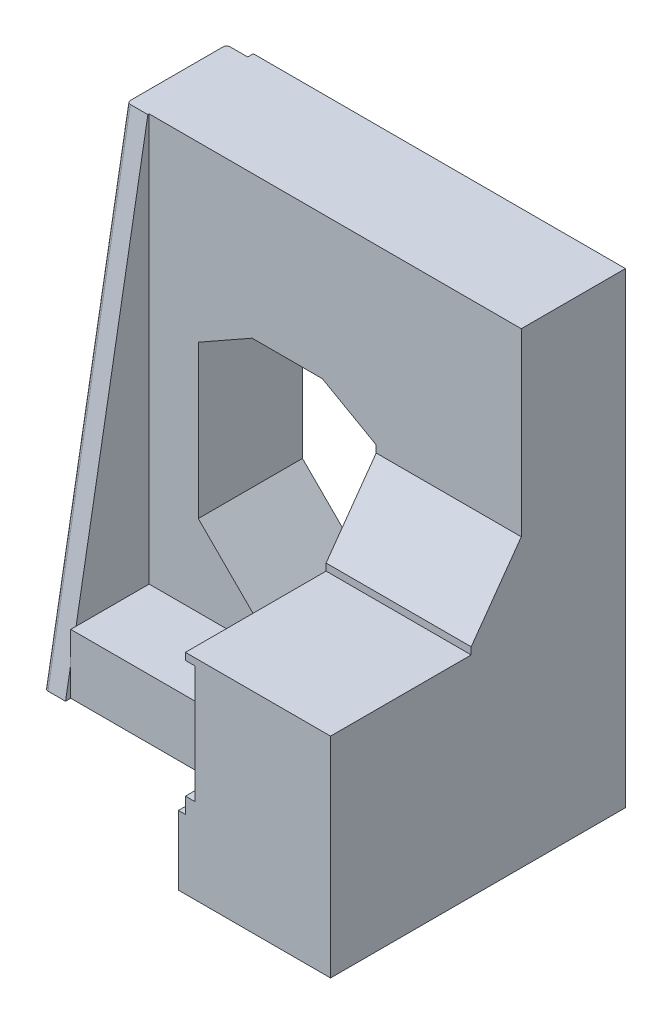
ISO-10303-21;
HEADER;
FILE_DESCRIPTION(('STEP AP214'),'2;1');
FILE_NAME('part.step','',(''),(''),'','','');
FILE_SCHEMA(('AUTOMOTIVE_DESIGN { 1 0 10303 214 1 1 1 1 }'));
ENDSEC;
DATA;
#1=APPLICATION_CONTEXT('core data for automotive mechanical design processes');
#2=APPLICATION_PROTOCOL_DEFINITION('international standard','automotive_design',2000,#1);
#3=PRODUCT_CONTEXT('',#1,'mechanical');
#4=PRODUCT('Part','Part','',(#3));
#5=PRODUCT_RELATED_PRODUCT_CATEGORY('part','',(#4));
#6=PRODUCT_DEFINITION_FORMATION('','',#4);
#7=PRODUCT_DEFINITION_CONTEXT('part definition',#1,'design');
#8=PRODUCT_DEFINITION('design','',#6,#7);
#9=PRODUCT_DEFINITION_SHAPE('','',#8);
#10=(LENGTH_UNIT() NAMED_UNIT(*) SI_UNIT(.MILLI.,.METRE.));
#11=(NAMED_UNIT(*) PLANE_ANGLE_UNIT() SI_UNIT($,.RADIAN.));
#12=(NAMED_UNIT(*) SI_UNIT($,.STERADIAN.) SOLID_ANGLE_UNIT());
#13=UNCERTAINTY_MEASURE_WITH_UNIT(LENGTH_MEASURE(1.E-05),#10,'distance_accuracy_value','');
#14=(GEOMETRIC_REPRESENTATION_CONTEXT(3) GLOBAL_UNCERTAINTY_ASSIGNED_CONTEXT((#13)) GLOBAL_UNIT_ASSIGNED_CONTEXT((#10,
#11,#12)) REPRESENTATION_CONTEXT('',''));
#15=CARTESIAN_POINT('',(0.,0.,0.));
#16=DIRECTION('',(0.,0.,1.));
#17=DIRECTION('',(1.,0.,0.));
#18=AXIS2_PLACEMENT_3D('',#15,#16,#17);
#19=CARTESIAN_POINT('',(-90.,260.,990.));
#20=DIRECTION('',(0.,1.,0.));
#21=DIRECTION('',(-1.,0.,0.));
#22=AXIS2_PLACEMENT_3D('',#19,#20,#21);
#23=PLANE('',#22);
#24=DIRECTION('',(-1.,0.,0.));
#25=VECTOR('',#24,1.);
#26=CARTESIAN_POINT('',(1000.,260.,-690.));
#27=LINE('',#26,#25);
#28=CARTESIAN_POINT('',(74.,260.,-690.));
#29=VERTEX_POINT('',#28);
#30=CARTESIAN_POINT('',(-75.,260.,-690.));
#31=VERTEX_POINT('',#30);
#32=EDGE_CURVE('E39',#29,#31,#27,.T.);
#33=ORIENTED_EDGE('',*,*,#32,.T.);
#34=DIRECTION('',(0.,0.,1.));
#35=VECTOR('',#34,1.);
#36=CARTESIAN_POINT('',(-75.,260.,-690.));
#37=LINE('',#36,#35);
#38=CARTESIAN_POINT('',(-75.,260.,-245.));
#39=VERTEX_POINT('',#38);
#40=EDGE_CURVE('E242',#31,#39,#37,.T.);
#41=ORIENTED_EDGE('',*,*,#40,.T.);
#42=DIRECTION('',(-1.,0.,0.));
#43=VECTOR('',#42,1.);
#44=CARTESIAN_POINT('',(-90.,260.,-245.));
#45=LINE('',#44,#43);
#46=CARTESIAN_POINT('',(-590.,260.,-245.));
#47=VERTEX_POINT('',#46);
#48=EDGE_CURVE('E32',#39,#47,#45,.T.);
#49=ORIENTED_EDGE('',*,*,#48,.T.);
#50=DIRECTION('',(0.,0.,1.));
#51=VECTOR('',#50,1.);
#52=CARTESIAN_POINT('',(-590.,260.,-314.227673486614));
#53=LINE('',#52,#51);
#54=CARTESIAN_POINT('',(-590.,260.,67.2881234247409));
#55=VERTEX_POINT('',#54);
#56=EDGE_CURVE('E460',#47,#55,#53,.T.);
#57=ORIENTED_EDGE('',*,*,#56,.T.);
#58=DIRECTION('',(0.,0.,1.));
#59=VECTOR('',#58,1.);
#60=CARTESIAN_POINT('',(-590.,260.,-830.));
#61=LINE('',#60,#59);
#62=CARTESIAN_POINT('',(-590.,260.,90.));
#63=VERTEX_POINT('',#62);
#64=EDGE_CURVE('E280',#55,#63,#61,.T.);
#65=ORIENTED_EDGE('',*,*,#64,.T.);
#66=DIRECTION('',(1.,0.,0.));
#67=VECTOR('',#66,1.);
#68=CARTESIAN_POINT('',(-90.,260.,90.));
#69=LINE('',#68,#67);
#70=CARTESIAN_POINT('',(74.,260.,90.));
#71=VERTEX_POINT('',#70);
#72=EDGE_CURVE('E264',#63,#71,#69,.T.);
#73=ORIENTED_EDGE('',*,*,#72,.T.);
#74=DIRECTION('',(0.,0.,-1.));
#75=VECTOR('',#74,1.);
#76=CARTESIAN_POINT('',(74.,260.,990.));
#77=LINE('',#76,#75);
#78=EDGE_CURVE('E342',#71,#29,#77,.T.);
#79=ORIENTED_EDGE('',*,*,#78,.T.);
#80=EDGE_LOOP('',(#33,#41,#49,#57,#65,#73,#79));
#81=FACE_BOUND('',#80,.T.);
#82=ADVANCED_FACE('F17',(#81),#23,.T.);
#83=CARTESIAN_POINT('',(-380.,1260.,990.));
#84=DIRECTION('',(1.,0.,0.));
#85=DIRECTION('',(0.,1.,0.));
#86=AXIS2_PLACEMENT_3D('',#83,#84,#85);
#87=PLANE('',#86);
#88=DIRECTION('',(0.,-1.,0.));
#89=VECTOR('',#88,1.);
#90=CARTESIAN_POINT('',(-380.,1260.,-245.));
#91=LINE('',#90,#89);
#92=CARTESIAN_POINT('',(-380.,1260.,-245.));
#93=VERTEX_POINT('',#92);
#94=CARTESIAN_POINT('',(-380.,607.5,-245.));
#95=VERTEX_POINT('',#94);
#96=EDGE_CURVE('E301',#93,#95,#91,.T.);
#97=ORIENTED_EDGE('',*,*,#96,.T.);
#98=DIRECTION('',(0.,0.,1.));
#99=VECTOR('',#98,1.);
#100=CARTESIAN_POINT('',(-380.,607.5,-690.));
#101=LINE('',#100,#99);
#102=CARTESIAN_POINT('',(-380.,607.5,-690.));
#103=VERTEX_POINT('',#102);
#104=EDGE_CURVE('E234',#103,#95,#101,.T.);
#105=ORIENTED_EDGE('',*,*,#104,.F.);
#106=DIRECTION('',(0.,1.,0.));
#107=VECTOR('',#106,1.);
#108=CARTESIAN_POINT('',(-380.,5.00000000000008,-690.));
#109=LINE('',#108,#107);
#110=CARTESIAN_POINT('',(-380.,1260.,-690.));
#111=VERTEX_POINT('',#110);
#112=EDGE_CURVE('E368',#103,#111,#109,.T.);
#113=ORIENTED_EDGE('',*,*,#112,.T.);
#114=DIRECTION('',(0.,0.,-1.));
#115=VECTOR('',#114,1.);
#116=CARTESIAN_POINT('',(-380.,1260.,990.));
#117=LINE('',#116,#115);
#118=EDGE_CURVE('E344',#93,#111,#117,.T.);
#119=ORIENTED_EDGE('',*,*,#118,.F.);
#120=EDGE_LOOP('',(#97,#105,#113,#119));
#121=FACE_BOUND('',#120,.T.);
#122=ADVANCED_FACE('F554',(#121),#87,.T.);
#123=CARTESIAN_POINT('',(-590.,4.9999999999999,-314.227673486614));
#124=DIRECTION('',(1.,0.,0.));
#125=DIRECTION('',(0.,-0.17364817766693,-0.984807753012208));
#126=AXIS2_PLACEMENT_3D('',#123,#124,#125);
#127=PLANE('',#126);
#128=ORIENTED_EDGE('',*,*,#56,.F.);
#129=DIRECTION('',(0.,1.,0.));
#130=VECTOR('',#129,1.);
#131=CARTESIAN_POINT('',(-590.,2000.,-245.));
#132=LINE('',#131,#130);
#133=CARTESIAN_POINT('',(-590.,2000.,-245.));
#134=VERTEX_POINT('',#133);
#135=EDGE_CURVE('E303',#47,#134,#132,.T.);
#136=ORIENTED_EDGE('',*,*,#135,.T.);
#137=DIRECTION('',(0.,0.,1.));
#138=VECTOR('',#137,1.);
#139=CARTESIAN_POINT('',(-590.,2000.,-666.));
#140=LINE('',#139,#138);
#141=CARTESIAN_POINT('',(-590.,2000.,-239.520823007988));
#142=VERTEX_POINT('',#141);
#143=EDGE_CURVE('E438',#134,#142,#140,.T.);
#144=ORIENTED_EDGE('',*,*,#143,.T.);
#145=DIRECTION('',(0.,-0.984807753012208,0.17364817766693));
#146=VECTOR('',#145,1.);
#147=CARTESIAN_POINT('',(-590.,2000.,-239.520823007988));
#148=LINE('',#147,#146);
#149=EDGE_CURVE('E442',#142,#55,#148,.T.);
#150=ORIENTED_EDGE('',*,*,#149,.T.);
#151=EDGE_LOOP('',(#128,#136,#144,#150));
#152=FACE_BOUND('',#151,.T.);
#153=ADVANCED_FACE('F559',(#152),#127,.T.);
#154=CARTESIAN_POINT('',(-680.,4.99999999999988,112.251503505399));
#155=DIRECTION('',(0.,-1.,0.));
#156=DIRECTION('',(0.,0.,1.));
#157=AXIS2_PLACEMENT_3D('',#154,#155,#156);
#158=PLANE('',#157);
#159=DIRECTION('',(1.,0.,0.));
#160=VECTOR('',#159,1.);
#161=CARTESIAN_POINT('',(-590.,5.,570.));
#162=LINE('',#161,#160);
#163=CARTESIAN_POINT('',(350.,4.99999999999987,570.));
#164=VERTEX_POINT('',#163);
#165=CARTESIAN_POINT('',(1000.,5.,570.));
#166=VERTEX_POINT('',#165);
#167=EDGE_CURVE('E379',#164,#166,#162,.T.);
#168=ORIENTED_EDGE('',*,*,#167,.F.);
#169=DIRECTION('',(0.,0.,-1.));
#170=VECTOR('',#169,1.);
#171=CARTESIAN_POINT('',(350.,4.99999999999984,112.251503505399));
#172=LINE('',#171,#170);
#173=CARTESIAN_POINT('',(350.,4.99999999999984,90.));
#174=VERTEX_POINT('',#173);
#175=EDGE_CURVE('E273',#164,#174,#172,.T.);
#176=ORIENTED_EDGE('',*,*,#175,.T.);
#177=DIRECTION('',(-1.,0.,0.));
#178=VECTOR('',#177,1.);
#179=CARTESIAN_POINT('',(-680.,4.99999999999988,90.));
#180=LINE('',#179,#178);
#181=CARTESIAN_POINT('',(-590.,4.99999999999989,90.));
#182=VERTEX_POINT('',#181);
#183=EDGE_CURVE('E267',#174,#182,#180,.T.);
#184=ORIENTED_EDGE('',*,*,#183,.T.);
#185=DIRECTION('',(0.,0.,1.));
#186=VECTOR('',#185,1.);
#187=CARTESIAN_POINT('',(-590.,4.99999999999988,112.251503505399));
#188=LINE('',#187,#186);
#189=CARTESIAN_POINT('',(-590.,5.,112.251503505399));
#190=VERTEX_POINT('',#189);
#191=EDGE_CURVE('E277',#182,#190,#188,.T.);
#192=ORIENTED_EDGE('',*,*,#191,.T.);
#193=DIRECTION('',(1.,0.,0.));
#194=VECTOR('',#193,1.);
#195=CARTESIAN_POINT('',(-680.,5.,112.251503505399));
#196=LINE('',#195,#194);
#197=CARTESIAN_POINT('',(-665.,5.,112.251503505399));
#198=VERTEX_POINT('',#197);
#199=EDGE_CURVE('E448',#198,#190,#196,.T.);
#200=ORIENTED_EDGE('',*,*,#199,.F.);
#201=CARTESIAN_POINT('',(-665.,4.99999999999967,97.0201043271133));
#202=DIRECTION('',(0.,-1.,0.));
#203=DIRECTION('',(0.,0.,-1.));
#204=AXIS2_PLACEMENT_3D('',#201,#202,#203);
#205=ELLIPSE('',#204,15.2313991782861,15.);
#206=CARTESIAN_POINT('',(-680.,4.99999999999988,97.0201043271132));
#207=VERTEX_POINT('',#206);
#208=EDGE_CURVE('E465',#198,#207,#205,.T.);
#209=ORIENTED_EDGE('',*,*,#208,.T.);
#210=DIRECTION('',(0.,0.,-1.));
#211=VECTOR('',#210,1.);
#212=CARTESIAN_POINT('',(-680.,4.99999999999988,112.251503505399));
#213=LINE('',#212,#211);
#214=CARTESIAN_POINT('',(-680.,4.99999999999989,-298.996274308327));
#215=VERTEX_POINT('',#214);
#216=EDGE_CURVE('E445',#207,#215,#213,.T.);
#217=ORIENTED_EDGE('',*,*,#216,.T.);
#218=CARTESIAN_POINT('',(-665.,4.99999999999987,-298.996274308327));
#219=DIRECTION('',(0.,-1.,0.));
#220=DIRECTION('',(0.,0.,1.));
#221=AXIS2_PLACEMENT_3D('',#218,#219,#220);
#222=ELLIPSE('',#221,15.2313991782861,15.);
#223=CARTESIAN_POINT('',(-665.,4.99999999999946,-314.227673486614));
#224=VERTEX_POINT('',#223);
#225=EDGE_CURVE('E479',#215,#224,#222,.T.);
#226=ORIENTED_EDGE('',*,*,#225,.T.);
#227=DIRECTION('',(1.,0.,0.));
#228=VECTOR('',#227,1.);
#229=CARTESIAN_POINT('',(-680.,4.99999999999946,-314.227673486614));
#230=LINE('',#229,#228);
#231=CARTESIAN_POINT('',(-590.,4.99999999999945,-314.227673486614));
#232=VERTEX_POINT('',#231);
#233=EDGE_CURVE('E458',#224,#232,#230,.T.);
#234=ORIENTED_EDGE('',*,*,#233,.T.);
#235=DIRECTION('',(0.,0.,1.));
#236=VECTOR('',#235,1.);
#237=CARTESIAN_POINT('',(-590.,4.99999999999987,-690.));
#238=LINE('',#237,#236);
#239=CARTESIAN_POINT('',(-590.,4.99999999999987,-690.));
#240=VERTEX_POINT('',#239);
#241=EDGE_CURVE('E393',#240,#232,#238,.T.);
#242=ORIENTED_EDGE('',*,*,#241,.F.);
#243=DIRECTION('',(1.,0.,0.));
#244=VECTOR('',#243,1.);
#245=CARTESIAN_POINT('',(-590.,5.,-690.));
#246=LINE('',#245,#244);
#247=CARTESIAN_POINT('',(1000.,5.,-690.));
#248=VERTEX_POINT('',#247);
#249=EDGE_CURVE('E383',#240,#248,#246,.T.);
#250=ORIENTED_EDGE('',*,*,#249,.T.);
#251=DIRECTION('',(0.,0.,1.));
#252=VECTOR('',#251,1.);
#253=CARTESIAN_POINT('',(1000.,5.,-690.));
#254=LINE('',#253,#252);
#255=EDGE_CURVE('E404',#248,#166,#254,.T.);
#256=ORIENTED_EDGE('',*,*,#255,.T.);
#257=EDGE_LOOP('',(#168,#176,#184,#192,#200,#209,#217,#226,#234,#242,#250,#256));
#258=FACE_BOUND('',#257,.T.);
#259=ADVANCED_FACE('F19',(#258),#158,.T.);
#260=CARTESIAN_POINT('',(1000.,5.,570.));
#261=DIRECTION('',(0.,0.,1.));
#262=DIRECTION('',(1.,0.,0.));
#263=AXIS2_PLACEMENT_3D('',#260,#261,#262);
#264=PLANE('',#263);
#265=DIRECTION('',(-1.,0.,0.));
#266=VECTOR('',#265,1.);
#267=CARTESIAN_POINT('',(1000.,300.,570.));
#268=LINE('',#267,#266);
#269=CARTESIAN_POINT('',(380.,300.,570.));
#270=VERTEX_POINT('',#269);
#271=CARTESIAN_POINT('',(350.,300.,570.));
#272=VERTEX_POINT('',#271);
#273=EDGE_CURVE('E421',#270,#272,#268,.T.);
#274=ORIENTED_EDGE('',*,*,#273,.T.);
#275=DIRECTION('',(0.,-1.,0.));
#276=VECTOR('',#275,1.);
#277=CARTESIAN_POINT('',(350.,5.,570.));
#278=LINE('',#277,#276);
#279=EDGE_CURVE('E270',#272,#164,#278,.T.);
#280=ORIENTED_EDGE('',*,*,#279,.T.);
#281=ORIENTED_EDGE('',*,*,#167,.T.);
#282=DIRECTION('',(0.,1.,0.));
#283=VECTOR('',#282,1.);
#284=CARTESIAN_POINT('',(1000.,5.,570.));
#285=LINE('',#284,#283);
#286=CARTESIAN_POINT('',(1000.,900.,570.));
#287=VERTEX_POINT('',#286);
#288=EDGE_CURVE('E380',#166,#287,#285,.T.);
#289=ORIENTED_EDGE('',*,*,#288,.T.);
#290=DIRECTION('',(-1.,0.,0.));
#291=VECTOR('',#290,1.);
#292=CARTESIAN_POINT('',(1000.,900.,570.));
#293=LINE('',#292,#291);
#294=CARTESIAN_POINT('',(380.,900.,570.));
#295=VERTEX_POINT('',#294);
#296=EDGE_CURVE('E317',#287,#295,#293,.T.);
#297=ORIENTED_EDGE('',*,*,#296,.T.);
#298=DIRECTION('',(0.,-1.,0.));
#299=VECTOR('',#298,1.);
#300=CARTESIAN_POINT('',(380.,5.,570.));
#301=LINE('',#300,#299);
#302=CARTESIAN_POINT('',(380.,870.,570.));
#303=VERTEX_POINT('',#302);
#304=EDGE_CURVE('E407',#295,#303,#301,.T.);
#305=ORIENTED_EDGE('',*,*,#304,.T.);
#306=DIRECTION('',(1.,0.,0.));
#307=VECTOR('',#306,1.);
#308=CARTESIAN_POINT('',(1000.,870.,570.));
#309=LINE('',#308,#307);
#310=CARTESIAN_POINT('',(420.,870.,570.));
#311=VERTEX_POINT('',#310);
#312=EDGE_CURVE('E409',#303,#311,#309,.T.);
#313=ORIENTED_EDGE('',*,*,#312,.T.);
#314=DIRECTION('',(0.,-1.,0.));
#315=VECTOR('',#314,1.);
#316=CARTESIAN_POINT('',(420.,5.,570.));
#317=LINE('',#316,#315);
#318=CARTESIAN_POINT('',(420.,368.,570.));
#319=VERTEX_POINT('',#318);
#320=EDGE_CURVE('E412',#311,#319,#317,.T.);
#321=ORIENTED_EDGE('',*,*,#320,.T.);
#322=DIRECTION('',(-1.,0.,0.));
#323=VECTOR('',#322,1.);
#324=CARTESIAN_POINT('',(1000.,368.,570.));
#325=LINE('',#324,#323);
#326=CARTESIAN_POINT('',(380.,368.,570.));
#327=VERTEX_POINT('',#326);
#328=EDGE_CURVE('E415',#319,#327,#325,.T.);
#329=ORIENTED_EDGE('',*,*,#328,.T.);
#330=DIRECTION('',(0.,-1.,0.));
#331=VECTOR('',#330,1.);
#332=CARTESIAN_POINT('',(380.,5.,570.));
#333=LINE('',#332,#331);
#334=EDGE_CURVE('E418',#327,#270,#333,.T.);
#335=ORIENTED_EDGE('',*,*,#334,.T.);
#336=EDGE_LOOP('',(#274,#280,#281,#289,#297,#305,#313,#321,#329,#335));
#337=FACE_BOUND('',#336,.T.);
#338=ADVANCED_FACE('F540',(#337),#264,.T.);
#339=CARTESIAN_POINT('',(74.,260.,990.));
#340=DIRECTION('',(-0.92847669088526,0.371390676354104,0.));
#341=DIRECTION('',(-0.371390676354104,-0.928476690885259,0.));
#342=AXIS2_PLACEMENT_3D('',#339,#340,#341);
#343=PLANE('',#342);
#344=ORIENTED_EDGE('',*,*,#78,.F.);
#345=DIRECTION('',(0.371390676354104,0.928476690885259,0.));
#346=VECTOR('',#345,1.);
#347=CARTESIAN_POINT('',(74.,260.,90.));
#348=LINE('',#347,#346);
#349=CARTESIAN_POINT('',(90.,300.,90.));
#350=VERTEX_POINT('',#349);
#351=EDGE_CURVE('E261',#71,#350,#348,.T.);
#352=ORIENTED_EDGE('',*,*,#351,.T.);
#353=DIRECTION('',(0.,0.,-1.));
#354=VECTOR('',#353,1.);
#355=CARTESIAN_POINT('',(90.,300.,990.));
#356=LINE('',#355,#354);
#357=CARTESIAN_POINT('',(90.,300.,-690.));
#358=VERTEX_POINT('',#357);
#359=EDGE_CURVE('E340',#350,#358,#356,.T.);
#360=ORIENTED_EDGE('',*,*,#359,.T.);
#361=DIRECTION('',(-0.371390676354104,-0.928476690885259,0.));
#362=VECTOR('',#361,1.);
#363=CARTESIAN_POINT('',(113.793103448276,359.48275862069,-690.));
#364=LINE('',#363,#362);
#365=EDGE_CURVE('E364',#358,#29,#364,.T.);
#366=ORIENTED_EDGE('',*,*,#365,.T.);
#367=EDGE_LOOP('',(#344,#352,#360,#366));
#368=FACE_BOUND('',#367,.T.);
#369=ADVANCED_FACE('F489',(#368),#343,.T.);
#370=CARTESIAN_POINT('',(90.,300.,990.));
#371=DIRECTION('',(0.,1.,0.));
#372=DIRECTION('',(-1.,0.,0.));
#373=AXIS2_PLACEMENT_3D('',#370,#371,#372);
#374=PLANE('',#373);
#375=DIRECTION('',(1.,0.,0.));
#376=VECTOR('',#375,1.);
#377=CARTESIAN_POINT('',(90.,300.,90.));
#378=LINE('',#377,#376);
#379=CARTESIAN_POINT('',(350.,300.,90.));
#380=VERTEX_POINT('',#379);
#381=EDGE_CURVE('E25',#350,#380,#378,.T.);
#382=ORIENTED_EDGE('',*,*,#381,.T.);
#383=DIRECTION('',(0.,0.,1.));
#384=VECTOR('',#383,1.);
#385=CARTESIAN_POINT('',(350.,300.,990.));
#386=LINE('',#385,#384);
#387=EDGE_CURVE('E11',#380,#272,#386,.T.);
#388=ORIENTED_EDGE('',*,*,#387,.T.);
#389=ORIENTED_EDGE('',*,*,#273,.F.);
#390=DIRECTION('',(0.,0.,-1.));
#391=VECTOR('',#390,1.);
#392=CARTESIAN_POINT('',(380.,300.,990.));
#393=LINE('',#392,#391);
#394=CARTESIAN_POINT('',(380.,300.,-690.));
#395=VERTEX_POINT('',#394);
#396=EDGE_CURVE('E337',#270,#395,#393,.T.);
#397=ORIENTED_EDGE('',*,*,#396,.T.);
#398=DIRECTION('',(-1.,0.,0.));
#399=VECTOR('',#398,1.);
#400=CARTESIAN_POINT('',(1000.,300.,-690.));
#401=LINE('',#400,#399);
#402=EDGE_CURVE('E361',#395,#358,#401,.T.);
#403=ORIENTED_EDGE('',*,*,#402,.T.);
#404=ORIENTED_EDGE('',*,*,#359,.F.);
#405=EDGE_LOOP('',(#382,#388,#389,#397,#403,#404));
#406=FACE_BOUND('',#405,.T.);
#407=ADVANCED_FACE('F483',(#406),#374,.T.);
#408=CARTESIAN_POINT('',(-680.,4.99999999999946,-314.227673486614));
#409=DIRECTION('',(0.,-0.17364817766693,-0.984807753012208));
#410=DIRECTION('',(0.,-0.984807753012208,0.17364817766693));
#411=AXIS2_PLACEMENT_3D('',#408,#409,#410);
#412=PLANE('',#411);
#413=ORIENTED_EDGE('',*,*,#233,.F.);
#414=DIRECTION('',(0.,0.984807753012208,-0.17364817766693));
#415=VECTOR('',#414,1.);
#416=CARTESIAN_POINT('',(-665.,2000.,-666.));
#417=LINE('',#416,#415);
#418=CARTESIAN_POINT('',(-665.,2000.,-666.));
#419=VERTEX_POINT('',#418);
#420=EDGE_CURVE('E472',#224,#419,#417,.T.);
#421=ORIENTED_EDGE('',*,*,#420,.T.);
#422=DIRECTION('',(1.,0.,0.));
#423=VECTOR('',#422,1.);
#424=CARTESIAN_POINT('',(-680.,2000.,-666.));
#425=LINE('',#424,#423);
#426=CARTESIAN_POINT('',(-590.,2000.,-666.));
#427=VERTEX_POINT('',#426);
#428=EDGE_CURVE('E455',#419,#427,#425,.T.);
#429=ORIENTED_EDGE('',*,*,#428,.T.);
#430=DIRECTION('',(0.,0.984807753012208,-0.17364817766693));
#431=VECTOR('',#430,1.);
#432=CARTESIAN_POINT('',(-590.,4.99999999999945,-314.227673486614));
#433=LINE('',#432,#431);
#434=EDGE_CURVE('E436',#232,#427,#433,.T.);
#435=ORIENTED_EDGE('',*,*,#434,.F.);
#436=EDGE_LOOP('',(#413,#421,#429,#435));
#437=FACE_BOUND('',#436,.T.);
#438=ADVANCED_FACE('F526',(#437),#412,.T.);
#439=CARTESIAN_POINT('',(-680.,2000.,-666.));
#440=DIRECTION('',(0.,1.,0.));
#441=DIRECTION('',(0.,0.,-1.));
#442=AXIS2_PLACEMENT_3D('',#439,#440,#441);
#443=PLANE('',#442);
#444=ORIENTED_EDGE('',*,*,#428,.F.);
#445=CARTESIAN_POINT('',(-665.,2000.,-650.768600821714));
#446=DIRECTION('',(0.,1.,0.));
#447=DIRECTION('',(0.,0.,1.));
#448=AXIS2_PLACEMENT_3D('',#445,#446,#447);
#449=ELLIPSE('',#448,15.2313991782861,15.);
#450=CARTESIAN_POINT('',(-680.,2000.,-650.768600821714));
#451=VERTEX_POINT('',#450);
#452=EDGE_CURVE('E475',#419,#451,#449,.T.);
#453=ORIENTED_EDGE('',*,*,#452,.T.);
#454=DIRECTION('',(0.,0.,1.));
#455=VECTOR('',#454,1.);
#456=CARTESIAN_POINT('',(-680.,2000.,-666.));
#457=LINE('',#456,#455);
#458=CARTESIAN_POINT('',(-680.,2000.,-254.752222186273));
#459=VERTEX_POINT('',#458);
#460=EDGE_CURVE('E446',#451,#459,#457,.T.);
#461=ORIENTED_EDGE('',*,*,#460,.T.);
#462=CARTESIAN_POINT('',(-665.,2000.,-254.752222186273));
#463=DIRECTION('',(0.,1.,0.));
#464=DIRECTION('',(0.,0.,-1.));
#465=AXIS2_PLACEMENT_3D('',#462,#463,#464);
#466=ELLIPSE('',#465,15.2313991782861,15.);
#467=CARTESIAN_POINT('',(-665.,2000.,-239.520823007988));
#468=VERTEX_POINT('',#467);
#469=EDGE_CURVE('E470',#459,#468,#466,.T.);
#470=ORIENTED_EDGE('',*,*,#469,.T.);
#471=DIRECTION('',(1.,0.,0.));
#472=VECTOR('',#471,1.);
#473=CARTESIAN_POINT('',(-680.,2000.,-239.520823007988));
#474=LINE('',#473,#472);
#475=EDGE_CURVE('E453',#468,#142,#474,.T.);
#476=ORIENTED_EDGE('',*,*,#475,.T.);
#477=ORIENTED_EDGE('',*,*,#143,.F.);
#478=DIRECTION('',(1.,0.,0.));
#479=VECTOR('',#478,1.);
#480=CARTESIAN_POINT('',(1000.,2000.,-245.));
#481=LINE('',#480,#479);
#482=CARTESIAN_POINT('',(1000.,2000.,-245.));
#483=VERTEX_POINT('',#482);
#484=EDGE_CURVE('E305',#134,#483,#481,.T.);
#485=ORIENTED_EDGE('',*,*,#484,.T.);
#486=DIRECTION('',(0.,0.,1.));
#487=VECTOR('',#486,1.);
#488=CARTESIAN_POINT('',(1000.,2000.,-690.));
#489=LINE('',#488,#487);
#490=CARTESIAN_POINT('',(1000.,2000.,-690.));
#491=VERTEX_POINT('',#490);
#492=EDGE_CURVE('E401',#491,#483,#489,.T.);
#493=ORIENTED_EDGE('',*,*,#492,.F.);
#494=DIRECTION('',(-1.,0.,0.));
#495=VECTOR('',#494,1.);
#496=CARTESIAN_POINT('',(1000.,2000.,-690.));
#497=LINE('',#496,#495);
#498=CARTESIAN_POINT('',(-590.,2000.,-690.));
#499=VERTEX_POINT('',#498);
#500=EDGE_CURVE('E388',#491,#499,#497,.T.);
#501=ORIENTED_EDGE('',*,*,#500,.T.);
#502=DIRECTION('',(0.,0.,1.));
#503=VECTOR('',#502,1.);
#504=CARTESIAN_POINT('',(-590.,2000.,-690.));
#505=LINE('',#504,#503);
#506=EDGE_CURVE('E398',#499,#427,#505,.T.);
#507=ORIENTED_EDGE('',*,*,#506,.T.);
#508=EDGE_LOOP('',(#444,#453,#461,#470,#476,#477,#485,#493,#501,#507));
#509=FACE_BOUND('',#508,.T.);
#510=ADVANCED_FACE('F594',(#509),#443,.T.);
#511=CARTESIAN_POINT('',(-680.,2000.,-239.520823007988));
#512=DIRECTION('',(0.,0.17364817766693,0.984807753012208));
#513=DIRECTION('',(0.,0.984807753012208,-0.17364817766693));
#514=AXIS2_PLACEMENT_3D('',#511,#512,#513);
#515=PLANE('',#514);
#516=ORIENTED_EDGE('',*,*,#475,.F.);
#517=DIRECTION('',(0.,-0.984807753012208,0.17364817766693));
#518=VECTOR('',#517,1.);
#519=CARTESIAN_POINT('',(-665.,4.99999999999929,112.2515035054));
#520=LINE('',#519,#518);
#521=EDGE_CURVE('E462',#468,#198,#520,.T.);
#522=ORIENTED_EDGE('',*,*,#521,.T.);
#523=ORIENTED_EDGE('',*,*,#199,.T.);
#524=CARTESIAN_POINT('',(-590.,131.194547289329,90.));
#525=VERTEX_POINT('',#524);
#526=EDGE_CURVE('E276',#525,#190,#148,.T.);
#527=ORIENTED_EDGE('',*,*,#526,.F.);
#528=EDGE_CURVE('E441',#55,#525,#148,.T.);
#529=ORIENTED_EDGE('',*,*,#528,.F.);
#530=ORIENTED_EDGE('',*,*,#149,.F.);
#531=EDGE_LOOP('',(#516,#522,#523,#527,#529,#530));
#532=FACE_BOUND('',#531,.T.);
#533=ADVANCED_FACE('F507',(#532),#515,.T.);
#534=CARTESIAN_POINT('',(-680.,4.99999999999991,-314.227673486614));
#535=DIRECTION('',(1.,0.,0.));
#536=DIRECTION('',(0.,-0.17364817766693,-0.984807753012208));
#537=AXIS2_PLACEMENT_3D('',#534,#535,#536);
#538=PLANE('',#537);
#539=ORIENTED_EDGE('',*,*,#460,.F.);
#540=DIRECTION('',(0.,0.984807753012208,-0.17364817766693));
#541=VECTOR('',#540,1.);
#542=CARTESIAN_POINT('',(-680.,7.6047226650034,-299.45555719143));
#543=LINE('',#542,#541);
#544=EDGE_CURVE('E477',#451,#215,#543,.F.);
#545=ORIENTED_EDGE('',*,*,#544,.T.);
#546=ORIENTED_EDGE('',*,*,#216,.F.);
#547=DIRECTION('',(0.,-0.984807753012208,0.17364817766693));
#548=VECTOR('',#547,1.);
#549=CARTESIAN_POINT('',(-680.,1997.39527733499,-254.29293930317));
#550=LINE('',#549,#548);
#551=EDGE_CURVE('E467',#207,#459,#550,.F.);
#552=ORIENTED_EDGE('',*,*,#551,.T.);
#553=EDGE_LOOP('',(#539,#545,#546,#552));
#554=FACE_BOUND('',#553,.T.);
#555=ADVANCED_FACE('F517',(#554),#538,.F.);
#556=CARTESIAN_POINT('',(-590.,2000.,-690.));
#557=DIRECTION('',(-1.,0.,0.));
#558=DIRECTION('',(0.,1.,0.));
#559=AXIS2_PLACEMENT_3D('',#556,#557,#558);
#560=PLANE('',#559);
#561=DIRECTION('',(0.,-1.,0.));
#562=VECTOR('',#561,1.);
#563=CARTESIAN_POINT('',(-590.,2000.,-690.));
#564=LINE('',#563,#562);
#565=EDGE_CURVE('E391',#499,#240,#564,.T.);
#566=ORIENTED_EDGE('',*,*,#565,.T.);
#567=ORIENTED_EDGE('',*,*,#241,.T.);
#568=ORIENTED_EDGE('',*,*,#434,.T.);
#569=ORIENTED_EDGE('',*,*,#506,.F.);
#570=EDGE_LOOP('',(#566,#567,#568,#569));
#571=FACE_BOUND('',#570,.T.);
#572=ADVANCED_FACE('F530',(#571),#560,.T.);
#573=DIRECTION('',(0.,-1.,0.));
#574=VECTOR('',#573,1.);
#575=CARTESIAN_POINT('',(-590.,382.5,90.));
#576=LINE('',#575,#574);
#577=EDGE_CURVE('E257',#63,#525,#576,.T.);
#578=ORIENTED_EDGE('',*,*,#577,.F.);
#579=ORIENTED_EDGE('',*,*,#64,.F.);
#580=ORIENTED_EDGE('',*,*,#528,.T.);
#581=EDGE_LOOP('',(#578,#579,#580));
#582=FACE_BOUND('',#581,.T.);
#583=ADVANCED_FACE('F497',(#582),#560,.T.);
#584=CARTESIAN_POINT('',(1000.,5.,-690.));
#585=DIRECTION('',(0.,0.,1.));
#586=DIRECTION('',(1.,0.,0.));
#587=AXIS2_PLACEMENT_3D('',#584,#585,#586);
#588=PLANE('',#587);
#589=ORIENTED_EDGE('',*,*,#112,.F.);
#590=DIRECTION('',(0.707106781186548,-0.707106781186548,0.));
#591=VECTOR('',#590,1.);
#592=CARTESIAN_POINT('',(-380.,607.5,-690.));
#593=LINE('',#592,#591);
#594=CARTESIAN_POINT('',(-120.,347.5,-690.));
#595=VERTEX_POINT('',#594);
#596=EDGE_CURVE('E246',#103,#595,#593,.T.);
#597=ORIENTED_EDGE('',*,*,#596,.T.);
#598=DIRECTION('',(0.457348012620762,-0.889287802318147,0.));
#599=VECTOR('',#598,1.);
#600=CARTESIAN_POINT('',(-120.,347.5,-690.));
#601=LINE('',#600,#599);
#602=EDGE_CURVE('E241',#595,#31,#601,.T.);
#603=ORIENTED_EDGE('',*,*,#602,.T.);
#604=ORIENTED_EDGE('',*,*,#32,.F.);
#605=ORIENTED_EDGE('',*,*,#365,.F.);
#606=ORIENTED_EDGE('',*,*,#402,.F.);
#607=DIRECTION('',(0.,-1.,0.));
#608=VECTOR('',#607,1.);
#609=CARTESIAN_POINT('',(380.,5.,-690.));
#610=LINE('',#609,#608);
#611=CARTESIAN_POINT('',(380.,368.,-690.));
#612=VERTEX_POINT('',#611);
#613=EDGE_CURVE('E359',#612,#395,#610,.T.);
#614=ORIENTED_EDGE('',*,*,#613,.F.);
#615=DIRECTION('',(-1.,0.,0.));
#616=VECTOR('',#615,1.);
#617=CARTESIAN_POINT('',(1000.,368.,-690.));
#618=LINE('',#617,#616);
#619=CARTESIAN_POINT('',(420.,368.,-690.));
#620=VERTEX_POINT('',#619);
#621=EDGE_CURVE('E357',#620,#612,#618,.T.);
#622=ORIENTED_EDGE('',*,*,#621,.F.);
#623=DIRECTION('',(0.,-1.,0.));
#624=VECTOR('',#623,1.);
#625=CARTESIAN_POINT('',(420.,5.,-690.));
#626=LINE('',#625,#624);
#627=CARTESIAN_POINT('',(420.,870.,-690.));
#628=VERTEX_POINT('',#627);
#629=EDGE_CURVE('E355',#628,#620,#626,.T.);
#630=ORIENTED_EDGE('',*,*,#629,.F.);
#631=DIRECTION('',(1.,0.,0.));
#632=VECTOR('',#631,1.);
#633=CARTESIAN_POINT('',(1000.,870.,-690.));
#634=LINE('',#633,#632);
#635=CARTESIAN_POINT('',(380.,870.,-690.));
#636=VERTEX_POINT('',#635);
#637=EDGE_CURVE('E353',#636,#628,#634,.T.);
#638=ORIENTED_EDGE('',*,*,#637,.F.);
#639=DIRECTION('',(0.,-1.,0.));
#640=VECTOR('',#639,1.);
#641=CARTESIAN_POINT('',(380.,5.,-690.));
#642=LINE('',#641,#640);
#643=CARTESIAN_POINT('',(380.,1260.,-690.));
#644=VERTEX_POINT('',#643);
#645=EDGE_CURVE('E351',#644,#636,#642,.T.);
#646=ORIENTED_EDGE('',*,*,#645,.F.);
#647=DIRECTION('',(0.870562838720134,-0.492057256667902,0.));
#648=VECTOR('',#647,1.);
#649=CARTESIAN_POINT('',(1387.48567335244,690.551575931232,-690.));
#650=LINE('',#649,#648);
#651=CARTESIAN_POINT('',(150.,1390.,-690.));
#652=VERTEX_POINT('',#651);
#653=EDGE_CURVE('E376',#652,#644,#650,.T.);
#654=ORIENTED_EDGE('',*,*,#653,.F.);
#655=DIRECTION('',(1.,0.,0.));
#656=VECTOR('',#655,1.);
#657=CARTESIAN_POINT('',(1000.,1390.,-690.));
#658=LINE('',#657,#656);
#659=CARTESIAN_POINT('',(-150.,1390.,-690.));
#660=VERTEX_POINT('',#659);
#661=EDGE_CURVE('E373',#660,#652,#658,.T.);
#662=ORIENTED_EDGE('',*,*,#661,.F.);
#663=DIRECTION('',(0.870562838720134,0.492057256667902,0.));
#664=VECTOR('',#663,1.);
#665=CARTESIAN_POINT('',(128.27363896848,1547.28510028653,-690.));
#666=LINE('',#665,#664);
#667=EDGE_CURVE('E370',#111,#660,#666,.T.);
#668=ORIENTED_EDGE('',*,*,#667,.F.);
#669=EDGE_LOOP('',(#589,#597,#603,#604,#605,#606,#614,#622,#630,#638,#646,#654,#662,#668));
#670=FACE_BOUND('',#669,.T.);
#671=ORIENTED_EDGE('',*,*,#565,.F.);
#672=ORIENTED_EDGE('',*,*,#500,.F.);
#673=DIRECTION('',(0.,1.,0.));
#674=VECTOR('',#673,1.);
#675=CARTESIAN_POINT('',(1000.,5.,-690.));
#676=LINE('',#675,#674);
#677=EDGE_CURVE('E385',#248,#491,#676,.T.);
#678=ORIENTED_EDGE('',*,*,#677,.F.);
#679=ORIENTED_EDGE('',*,*,#249,.F.);
#680=EDGE_LOOP('',(#671,#672,#678,#679));
#681=FACE_BOUND('',#680,.T.);
#682=ADVANCED_FACE('F534',(#670,#681),#588,.F.);
#683=CARTESIAN_POINT('',(1000.,5.,-690.));
#684=DIRECTION('',(1.,0.,0.));
#685=DIRECTION('',(0.,-1.,0.));
#686=AXIS2_PLACEMENT_3D('',#683,#684,#685);
#687=PLANE('',#686);
#688=DIRECTION('',(0.,-1.,0.));
#689=VECTOR('',#688,1.);
#690=CARTESIAN_POINT('',(1000.,5.00000000000007,-31.));
#691=LINE('',#690,#689);
#692=CARTESIAN_POINT('',(1000.,930.,-31.));
#693=VERTEX_POINT('',#692);
#694=CARTESIAN_POINT('',(1000.,900.,-31.0000000000004));
#695=VERTEX_POINT('',#694);
#696=EDGE_CURVE('E314',#693,#695,#691,.T.);
#697=ORIENTED_EDGE('',*,*,#696,.T.);
#698=DIRECTION('',(0.,0.,1.));
#699=VECTOR('',#698,1.);
#700=CARTESIAN_POINT('',(1000.,900.,-690.));
#701=LINE('',#700,#699);
#702=EDGE_CURVE('E320',#695,#287,#701,.T.);
#703=ORIENTED_EDGE('',*,*,#702,.T.);
#704=ORIENTED_EDGE('',*,*,#288,.F.);
#705=ORIENTED_EDGE('',*,*,#255,.F.);
#706=ORIENTED_EDGE('',*,*,#677,.T.);
#707=ORIENTED_EDGE('',*,*,#492,.T.);
#708=DIRECTION('',(0.,-1.,0.));
#709=VECTOR('',#708,1.);
#710=CARTESIAN_POINT('',(1000.,5.,-245.));
#711=LINE('',#710,#709);
#712=CARTESIAN_POINT('',(1000.,1230.,-245.));
#713=VERTEX_POINT('',#712);
#714=EDGE_CURVE('E308',#483,#713,#711,.T.);
#715=ORIENTED_EDGE('',*,*,#714,.T.);
#716=DIRECTION('',(0.,-0.814100020973207,0.580724681627554));
#717=VECTOR('',#716,1.);
#718=CARTESIAN_POINT('',(1000.,628.502165012224,184.068455624614));
#719=LINE('',#718,#717);
#720=EDGE_CURVE('E311',#713,#693,#719,.T.);
#721=ORIENTED_EDGE('',*,*,#720,.T.);
#722=EDGE_LOOP('',(#697,#703,#704,#705,#706,#707,#715,#721));
#723=FACE_BOUND('',#722,.T.);
#724=ADVANCED_FACE('F537',(#723),#687,.T.);
#725=CARTESIAN_POINT('',(380.,1260.,990.));
#726=DIRECTION('',(-0.492057256667902,-0.870562838720134,0.));
#727=DIRECTION('',(0.870562838720135,-0.492057256667902,0.));
#728=AXIS2_PLACEMENT_3D('',#725,#726,#727);
#729=PLANE('',#728);
#730=DIRECTION('',(0.,0.,-1.));
#731=VECTOR('',#730,1.);
#732=CARTESIAN_POINT('',(380.,1260.,990.));
#733=LINE('',#732,#731);
#734=CARTESIAN_POINT('',(380.,1260.,-245.));
#735=VERTEX_POINT('',#734);
#736=EDGE_CURVE('E323',#735,#644,#733,.T.);
#737=ORIENTED_EDGE('',*,*,#736,.F.);
#738=DIRECTION('',(-0.870562838720134,0.492057256667902,0.));
#739=VECTOR('',#738,1.);
#740=CARTESIAN_POINT('',(380.,1260.,-245.));
#741=LINE('',#740,#739);
#742=CARTESIAN_POINT('',(150.,1390.,-245.));
#743=VERTEX_POINT('',#742);
#744=EDGE_CURVE('E292',#735,#743,#741,.T.);
#745=ORIENTED_EDGE('',*,*,#744,.T.);
#746=DIRECTION('',(0.,0.,-1.));
#747=VECTOR('',#746,1.);
#748=CARTESIAN_POINT('',(150.,1390.,990.));
#749=LINE('',#748,#747);
#750=EDGE_CURVE('E349',#743,#652,#749,.T.);
#751=ORIENTED_EDGE('',*,*,#750,.T.);
#752=ORIENTED_EDGE('',*,*,#653,.T.);
#753=EDGE_LOOP('',(#737,#745,#751,#752));
#754=FACE_BOUND('',#753,.T.);
#755=ADVANCED_FACE('F573',(#754),#729,.T.);
#756=CARTESIAN_POINT('',(150.,1390.,990.));
#757=DIRECTION('',(0.,-1.,0.));
#758=DIRECTION('',(1.,0.,0.));
#759=AXIS2_PLACEMENT_3D('',#756,#757,#758);
#760=PLANE('',#759);
#761=ORIENTED_EDGE('',*,*,#750,.F.);
#762=DIRECTION('',(-1.,0.,0.));
#763=VECTOR('',#762,1.);
#764=CARTESIAN_POINT('',(150.,1390.,-245.));
#765=LINE('',#764,#763);
#766=CARTESIAN_POINT('',(-150.,1390.,-245.));
#767=VERTEX_POINT('',#766);
#768=EDGE_CURVE('E295',#743,#767,#765,.T.);
#769=ORIENTED_EDGE('',*,*,#768,.T.);
#770=DIRECTION('',(0.,0.,-1.));
#771=VECTOR('',#770,1.);
#772=CARTESIAN_POINT('',(-150.,1390.,990.));
#773=LINE('',#772,#771);
#774=EDGE_CURVE('E347',#767,#660,#773,.T.);
#775=ORIENTED_EDGE('',*,*,#774,.T.);
#776=ORIENTED_EDGE('',*,*,#661,.T.);
#777=EDGE_LOOP('',(#761,#769,#775,#776));
#778=FACE_BOUND('',#777,.T.);
#779=ADVANCED_FACE('F569',(#778),#760,.T.);
#780=CARTESIAN_POINT('',(-150.,1390.,990.));
#781=DIRECTION('',(0.492057256667902,-0.870562838720134,0.));
#782=DIRECTION('',(0.870562838720135,0.492057256667902,0.));
#783=AXIS2_PLACEMENT_3D('',#780,#781,#782);
#784=PLANE('',#783);
#785=ORIENTED_EDGE('',*,*,#774,.F.);
#786=DIRECTION('',(-0.870562838720134,-0.492057256667902,0.));
#787=VECTOR('',#786,1.);
#788=CARTESIAN_POINT('',(-150.,1390.,-245.));
#789=LINE('',#788,#787);
#790=EDGE_CURVE('E298',#767,#93,#789,.T.);
#791=ORIENTED_EDGE('',*,*,#790,.T.);
#792=ORIENTED_EDGE('',*,*,#118,.T.);
#793=ORIENTED_EDGE('',*,*,#667,.T.);
#794=EDGE_LOOP('',(#785,#791,#792,#793));
#795=FACE_BOUND('',#794,.T.);
#796=ADVANCED_FACE('F565',(#795),#784,.T.);
#797=CARTESIAN_POINT('',(380.,870.,990.));
#798=DIRECTION('',(-1.,0.,0.));
#799=DIRECTION('',(0.,-1.,0.));
#800=AXIS2_PLACEMENT_3D('',#797,#798,#799);
#801=PLANE('',#800);
#802=ORIENTED_EDGE('',*,*,#304,.F.);
#803=DIRECTION('',(0.,0.,-1.));
#804=VECTOR('',#803,1.);
#805=CARTESIAN_POINT('',(380.,900.,990.));
#806=LINE('',#805,#804);
#807=CARTESIAN_POINT('',(380.,900.,-31.));
#808=VERTEX_POINT('',#807);
#809=EDGE_CURVE('E433',#295,#808,#806,.T.);
#810=ORIENTED_EDGE('',*,*,#809,.T.);
#811=DIRECTION('',(0.,1.,0.));
#812=VECTOR('',#811,1.);
#813=CARTESIAN_POINT('',(380.,870.,-31.));
#814=LINE('',#813,#812);
#815=CARTESIAN_POINT('',(380.,930.,-31.));
#816=VERTEX_POINT('',#815);
#817=EDGE_CURVE('E430',#808,#816,#814,.T.);
#818=ORIENTED_EDGE('',*,*,#817,.T.);
#819=DIRECTION('',(0.,0.814100020973207,-0.580724681627554));
#820=VECTOR('',#819,1.);
#821=CARTESIAN_POINT('',(380.,407.53836637309,341.689298653863));
#822=LINE('',#821,#820);
#823=CARTESIAN_POINT('',(380.,1230.,-245.));
#824=VERTEX_POINT('',#823);
#825=EDGE_CURVE('E427',#816,#824,#822,.T.);
#826=ORIENTED_EDGE('',*,*,#825,.T.);
#827=DIRECTION('',(0.,1.,0.));
#828=VECTOR('',#827,1.);
#829=CARTESIAN_POINT('',(380.,870.,-245.));
#830=LINE('',#829,#828);
#831=EDGE_CURVE('E424',#824,#735,#830,.T.);
#832=ORIENTED_EDGE('',*,*,#831,.T.);
#833=ORIENTED_EDGE('',*,*,#736,.T.);
#834=ORIENTED_EDGE('',*,*,#645,.T.);
#835=DIRECTION('',(0.,0.,-1.));
#836=VECTOR('',#835,1.);
#837=CARTESIAN_POINT('',(380.,870.,990.));
#838=LINE('',#837,#836);
#839=EDGE_CURVE('E325',#303,#636,#838,.T.);
#840=ORIENTED_EDGE('',*,*,#839,.F.);
#841=EDGE_LOOP('',(#802,#810,#818,#826,#832,#833,#834,#840));
#842=FACE_BOUND('',#841,.T.);
#843=ADVANCED_FACE('F568',(#842),#801,.T.);
#844=CARTESIAN_POINT('',(380.,300.,990.));
#845=DIRECTION('',(-1.,0.,0.));
#846=DIRECTION('',(0.,-1.,0.));
#847=AXIS2_PLACEMENT_3D('',#844,#845,#846);
#848=PLANE('',#847);
#849=ORIENTED_EDGE('',*,*,#613,.T.);
#850=ORIENTED_EDGE('',*,*,#396,.F.);
#851=ORIENTED_EDGE('',*,*,#334,.F.);
#852=DIRECTION('',(0.,0.,-1.));
#853=VECTOR('',#852,1.);
#854=CARTESIAN_POINT('',(380.,368.,990.));
#855=LINE('',#854,#853);
#856=EDGE_CURVE('E334',#327,#612,#855,.T.);
#857=ORIENTED_EDGE('',*,*,#856,.T.);
#858=EDGE_LOOP('',(#849,#850,#851,#857));
#859=FACE_BOUND('',#858,.T.);
#860=ADVANCED_FACE('F605',(#859),#848,.T.);
#861=CARTESIAN_POINT('',(380.,368.,990.));
#862=DIRECTION('',(0.,1.,0.));
#863=DIRECTION('',(-1.,0.,0.));
#864=AXIS2_PLACEMENT_3D('',#861,#862,#863);
#865=PLANE('',#864);
#866=ORIENTED_EDGE('',*,*,#621,.T.);
#867=ORIENTED_EDGE('',*,*,#856,.F.);
#868=ORIENTED_EDGE('',*,*,#328,.F.);
#869=DIRECTION('',(0.,0.,-1.));
#870=VECTOR('',#869,1.);
#871=CARTESIAN_POINT('',(420.,368.,990.));
#872=LINE('',#871,#870);
#873=EDGE_CURVE('E331',#319,#620,#872,.T.);
#874=ORIENTED_EDGE('',*,*,#873,.T.);
#875=EDGE_LOOP('',(#866,#867,#868,#874));
#876=FACE_BOUND('',#875,.T.);
#877=ADVANCED_FACE('F608',(#876),#865,.T.);
#878=CARTESIAN_POINT('',(420.,368.,990.));
#879=DIRECTION('',(-1.,0.,0.));
#880=DIRECTION('',(0.,-1.,0.));
#881=AXIS2_PLACEMENT_3D('',#878,#879,#880);
#882=PLANE('',#881);
#883=ORIENTED_EDGE('',*,*,#629,.T.);
#884=ORIENTED_EDGE('',*,*,#873,.F.);
#885=ORIENTED_EDGE('',*,*,#320,.F.);
#886=DIRECTION('',(0.,0.,-1.));
#887=VECTOR('',#886,1.);
#888=CARTESIAN_POINT('',(420.,870.,990.));
#889=LINE('',#888,#887);
#890=EDGE_CURVE('E328',#311,#628,#889,.T.);
#891=ORIENTED_EDGE('',*,*,#890,.T.);
#892=EDGE_LOOP('',(#883,#884,#885,#891));
#893=FACE_BOUND('',#892,.T.);
#894=ADVANCED_FACE('F612',(#893),#882,.T.);
#895=CARTESIAN_POINT('',(420.,870.,990.));
#896=DIRECTION('',(0.,-1.,0.));
#897=DIRECTION('',(1.,0.,0.));
#898=AXIS2_PLACEMENT_3D('',#895,#896,#897);
#899=PLANE('',#898);
#900=ORIENTED_EDGE('',*,*,#637,.T.);
#901=ORIENTED_EDGE('',*,*,#890,.F.);
#902=ORIENTED_EDGE('',*,*,#312,.F.);
#903=ORIENTED_EDGE('',*,*,#839,.T.);
#904=EDGE_LOOP('',(#900,#901,#902,#903));
#905=FACE_BOUND('',#904,.T.);
#906=ADVANCED_FACE('F616',(#905),#899,.T.);
#907=CARTESIAN_POINT('',(2313.75,900.,730.));
#908=DIRECTION('',(0.,1.,0.));
#909=DIRECTION('',(0.,0.,1.));
#910=AXIS2_PLACEMENT_3D('',#907,#908,#909);
#911=PLANE('',#910);
#912=DIRECTION('',(-1.,0.,0.));
#913=VECTOR('',#912,1.);
#914=CARTESIAN_POINT('',(2313.75,900.,-31.0000000000008));
#915=LINE('',#914,#913);
#916=EDGE_CURVE('E289',#695,#808,#915,.T.);
#917=ORIENTED_EDGE('',*,*,#916,.T.);
#918=ORIENTED_EDGE('',*,*,#809,.F.);
#919=ORIENTED_EDGE('',*,*,#296,.F.);
#920=ORIENTED_EDGE('',*,*,#702,.F.);
#921=EDGE_LOOP('',(#917,#918,#919,#920));
#922=FACE_BOUND('',#921,.T.);
#923=ADVANCED_FACE('F620',(#922),#911,.T.);
#924=CARTESIAN_POINT('',(2313.75,900.,-31.0000000000006));
#925=DIRECTION('',(0.,0.,1.));
#926=DIRECTION('',(0.,-1.,0.));
#927=AXIS2_PLACEMENT_3D('',#924,#925,#926);
#928=PLANE('',#927);
#929=DIRECTION('',(-1.,0.,0.));
#930=VECTOR('',#929,1.);
#931=CARTESIAN_POINT('',(2313.75,930.,-31.0000000000006));
#932=LINE('',#931,#930);
#933=EDGE_CURVE('E286',#693,#816,#932,.T.);
#934=ORIENTED_EDGE('',*,*,#933,.T.);
#935=ORIENTED_EDGE('',*,*,#817,.F.);
#936=ORIENTED_EDGE('',*,*,#916,.F.);
#937=ORIENTED_EDGE('',*,*,#696,.F.);
#938=EDGE_LOOP('',(#934,#935,#936,#937));
#939=FACE_BOUND('',#938,.T.);
#940=ADVANCED_FACE('F627',(#939),#928,.T.);
#941=CARTESIAN_POINT('',(2313.75,930.,-31.0000000000006));
#942=DIRECTION('',(0.,0.580724681627554,0.814100020973207));
#943=DIRECTION('',(0.,-0.814100020973207,0.580724681627554));
#944=AXIS2_PLACEMENT_3D('',#941,#942,#943);
#945=PLANE('',#944);
#946=DIRECTION('',(-1.,0.,0.));
#947=VECTOR('',#946,1.);
#948=CARTESIAN_POINT('',(2313.75,1230.,-245.));
#949=LINE('',#948,#947);
#950=EDGE_CURVE('E283',#713,#824,#949,.T.);
#951=ORIENTED_EDGE('',*,*,#950,.T.);
#952=ORIENTED_EDGE('',*,*,#825,.F.);
#953=ORIENTED_EDGE('',*,*,#933,.F.);
#954=ORIENTED_EDGE('',*,*,#720,.F.);
#955=EDGE_LOOP('',(#951,#952,#953,#954));
#956=FACE_BOUND('',#955,.T.);
#957=ADVANCED_FACE('F631',(#956),#945,.T.);
#958=CARTESIAN_POINT('',(2313.75,1230.,-245.));
#959=DIRECTION('',(0.,0.,1.));
#960=DIRECTION('',(0.,-1.,0.));
#961=AXIS2_PLACEMENT_3D('',#958,#959,#960);
#962=PLANE('',#961);
#963=ORIENTED_EDGE('',*,*,#484,.F.);
#964=ORIENTED_EDGE('',*,*,#135,.F.);
#965=ORIENTED_EDGE('',*,*,#48,.F.);
#966=DIRECTION('',(0.457348012620762,-0.889287802318147,0.));
#967=VECTOR('',#966,1.);
#968=CARTESIAN_POINT('',(-120.,347.5,-245.));
#969=LINE('',#968,#967);
#970=CARTESIAN_POINT('',(-120.,347.5,-245.));
#971=VERTEX_POINT('',#970);
#972=EDGE_CURVE('E235',#971,#39,#969,.T.);
#973=ORIENTED_EDGE('',*,*,#972,.F.);
#974=DIRECTION('',(0.707106781186548,-0.707106781186548,0.));
#975=VECTOR('',#974,1.);
#976=CARTESIAN_POINT('',(-380.,607.5,-245.));
#977=LINE('',#976,#975);
#978=EDGE_CURVE('E228',#95,#971,#977,.T.);
#979=ORIENTED_EDGE('',*,*,#978,.F.);
#980=ORIENTED_EDGE('',*,*,#96,.F.);
#981=ORIENTED_EDGE('',*,*,#790,.F.);
#982=ORIENTED_EDGE('',*,*,#768,.F.);
#983=ORIENTED_EDGE('',*,*,#744,.F.);
#984=ORIENTED_EDGE('',*,*,#831,.F.);
#985=ORIENTED_EDGE('',*,*,#950,.F.);
#986=ORIENTED_EDGE('',*,*,#714,.F.);
#987=EDGE_LOOP('',(#963,#964,#965,#973,#979,#980,#981,#982,#983,#984,#985,#986));
#988=FACE_BOUND('',#987,.T.);
#989=ADVANCED_FACE('F245',(#988),#962,.T.);
#990=CARTESIAN_POINT('',(-665.,1997.39527733499,-254.29293930317));
#991=DIRECTION('',(0.,0.984807753012208,-0.17364817766693));
#992=DIRECTION('',(0.,0.17364817766693,0.984807753012208));
#993=AXIS2_PLACEMENT_3D('',#990,#991,#992);
#994=CYLINDRICAL_SURFACE('',#993,15.);
#995=ORIENTED_EDGE('',*,*,#469,.F.);
#996=ORIENTED_EDGE('',*,*,#551,.F.);
#997=ORIENTED_EDGE('',*,*,#208,.F.);
#998=ORIENTED_EDGE('',*,*,#521,.F.);
#999=EDGE_LOOP('',(#995,#996,#997,#998));
#1000=FACE_BOUND('',#999,.T.);
#1001=ADVANCED_FACE('F511',(#1000),#994,.T.);
#1002=CARTESIAN_POINT('',(-665.,7.6047226650034,-299.45555719143));
#1003=DIRECTION('',(0.,-0.984807753012208,0.17364817766693));
#1004=DIRECTION('',(0.,-0.17364817766693,-0.984807753012208));
#1005=AXIS2_PLACEMENT_3D('',#1002,#1003,#1004);
#1006=CYLINDRICAL_SURFACE('',#1005,15.);
#1007=ORIENTED_EDGE('',*,*,#225,.F.);
#1008=ORIENTED_EDGE('',*,*,#544,.F.);
#1009=ORIENTED_EDGE('',*,*,#452,.F.);
#1010=ORIENTED_EDGE('',*,*,#420,.F.);
#1011=EDGE_LOOP('',(#1007,#1008,#1009,#1010));
#1012=FACE_BOUND('',#1011,.T.);
#1013=ADVANCED_FACE('F520',(#1012),#1006,.T.);
#1014=CARTESIAN_POINT('',(-590.,382.5,90.));
#1015=DIRECTION('',(1.,0.,0.));
#1016=DIRECTION('',(0.,0.,-1.));
#1017=AXIS2_PLACEMENT_3D('',#1014,#1015,#1016);
#1018=PLANE('',#1017);
#1019=EDGE_CURVE('E254',#525,#182,#576,.T.);
#1020=ORIENTED_EDGE('',*,*,#1019,.F.);
#1021=ORIENTED_EDGE('',*,*,#526,.T.);
#1022=ORIENTED_EDGE('',*,*,#191,.F.);
#1023=EDGE_LOOP('',(#1020,#1021,#1022));
#1024=FACE_BOUND('',#1023,.T.);
#1025=ADVANCED_FACE('F502',(#1024),#1018,.T.);
#1026=CARTESIAN_POINT('',(350.,382.5,772.5));
#1027=DIRECTION('',(-1.,0.,0.));
#1028=DIRECTION('',(0.,0.,1.));
#1029=AXIS2_PLACEMENT_3D('',#1026,#1027,#1028);
#1030=PLANE('',#1029);
#1031=ORIENTED_EDGE('',*,*,#279,.F.);
#1032=ORIENTED_EDGE('',*,*,#387,.F.);
#1033=DIRECTION('',(0.,-1.,0.));
#1034=VECTOR('',#1033,1.);
#1035=CARTESIAN_POINT('',(350.,382.5,90.));
#1036=LINE('',#1035,#1034);
#1037=EDGE_CURVE('E258',#380,#174,#1036,.T.);
#1038=ORIENTED_EDGE('',*,*,#1037,.T.);
#1039=ORIENTED_EDGE('',*,*,#175,.F.);
#1040=EDGE_LOOP('',(#1031,#1032,#1038,#1039));
#1041=FACE_BOUND('',#1040,.T.);
#1042=ADVANCED_FACE('F542',(#1041),#1030,.T.);
#1043=CARTESIAN_POINT('',(350.,382.5,90.));
#1044=DIRECTION('',(0.,0.,1.));
#1045=DIRECTION('',(1.,0.,0.));
#1046=AXIS2_PLACEMENT_3D('',#1043,#1044,#1045);
#1047=PLANE('',#1046);
#1048=ORIENTED_EDGE('',*,*,#1037,.F.);
#1049=ORIENTED_EDGE('',*,*,#381,.F.);
#1050=ORIENTED_EDGE('',*,*,#351,.F.);
#1051=ORIENTED_EDGE('',*,*,#72,.F.);
#1052=ORIENTED_EDGE('',*,*,#577,.T.);
#1053=ORIENTED_EDGE('',*,*,#1019,.T.);
#1054=ORIENTED_EDGE('',*,*,#183,.F.);
#1055=EDGE_LOOP('',(#1048,#1049,#1050,#1051,#1052,#1053,#1054));
#1056=FACE_BOUND('',#1055,.T.);
#1057=ADVANCED_FACE('F486',(#1056),#1047,.T.);
#1058=CARTESIAN_POINT('',(-380.,607.5,-690.));
#1059=DIRECTION('',(-0.707106781186547,-0.707106781186548,0.));
#1060=DIRECTION('',(-0.707106781186548,0.707106781186548,0.));
#1061=AXIS2_PLACEMENT_3D('',#1058,#1059,#1060);
#1062=PLANE('',#1061);
#1063=ORIENTED_EDGE('',*,*,#978,.T.);
#1064=DIRECTION('',(0.,0.,1.));
#1065=VECTOR('',#1064,1.);
#1066=CARTESIAN_POINT('',(-120.,347.5,-690.));
#1067=LINE('',#1066,#1065);
#1068=EDGE_CURVE('E232',#595,#971,#1067,.T.);
#1069=ORIENTED_EDGE('',*,*,#1068,.F.);
#1070=ORIENTED_EDGE('',*,*,#596,.F.);
#1071=ORIENTED_EDGE('',*,*,#104,.T.);
#1072=EDGE_LOOP('',(#1063,#1069,#1070,#1071));
#1073=FACE_BOUND('',#1072,.T.);
#1074=ADVANCED_FACE('F230',(#1073),#1062,.F.);
#1075=CARTESIAN_POINT('',(-120.,347.5,-690.));
#1076=DIRECTION('',(-0.889287802318147,-0.457348012620762,0.));
#1077=DIRECTION('',(-0.457348012620762,0.889287802318147,0.));
#1078=AXIS2_PLACEMENT_3D('',#1075,#1076,#1077);
#1079=PLANE('',#1078);
#1080=ORIENTED_EDGE('',*,*,#972,.T.);
#1081=ORIENTED_EDGE('',*,*,#40,.F.);
#1082=ORIENTED_EDGE('',*,*,#602,.F.);
#1083=ORIENTED_EDGE('',*,*,#1068,.T.);
#1084=EDGE_LOOP('',(#1080,#1081,#1082,#1083));
#1085=FACE_BOUND('',#1084,.T.);
#1086=ADVANCED_FACE('F239',(#1085),#1079,.F.);
#1087=CLOSED_SHELL('',(#82,#122,#153,#259,#338,#369,#407,#438,#510,#533,#555,#572,#583,#682,
#724,#755,#779,#796,#843,#860,#877,#894,#906,#923,#940,#957,#989,#1001,#1013,#1025,#1042,#1057,
#1074,#1086));
#1088=MANIFOLD_SOLID_BREP('B1',#1087);
#1089=ADVANCED_BREP_SHAPE_REPRESENTATION('',(#18,#1088),#14);
#1090=SHAPE_DEFINITION_REPRESENTATION(#9,#1089);
ENDSEC;
END-ISO-10303-21;
